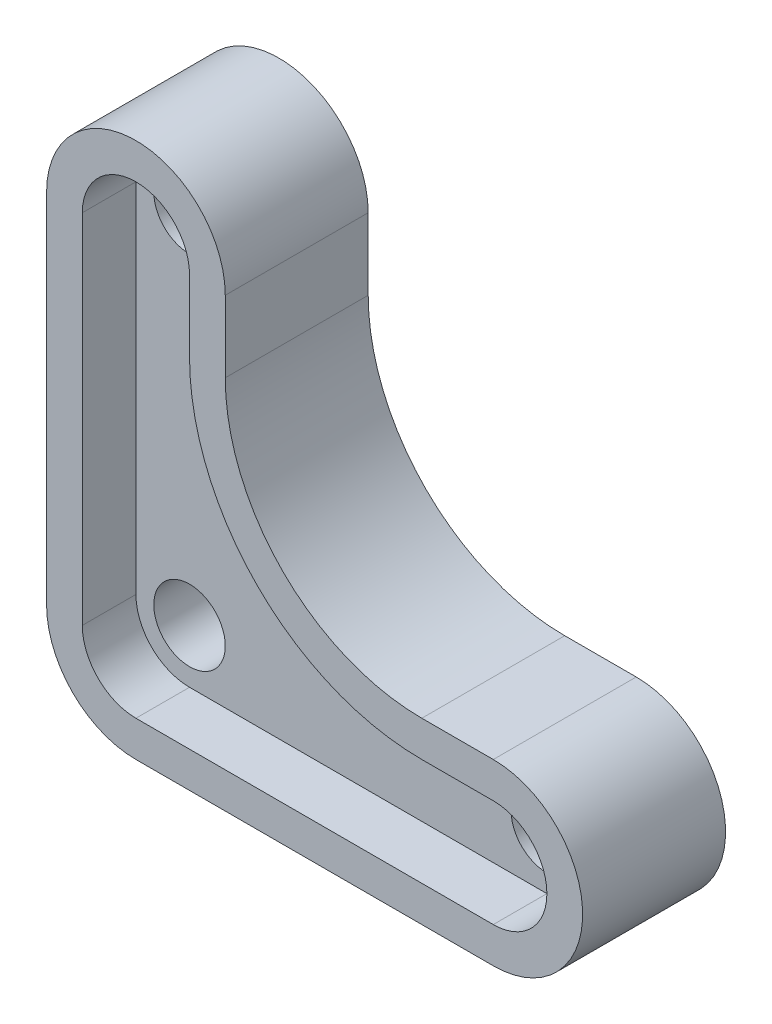
ISO-10303-21;
HEADER;
FILE_DESCRIPTION(('STEP AP214'),'2;1');
FILE_NAME('part.step','',(''),(''),'','','');
FILE_SCHEMA(('AUTOMOTIVE_DESIGN { 1 0 10303 214 1 1 1 1 }'));
ENDSEC;
DATA;
#1=APPLICATION_CONTEXT('core data for automotive mechanical design processes');
#2=APPLICATION_PROTOCOL_DEFINITION('international standard','automotive_design',2000,#1);
#3=PRODUCT_CONTEXT('',#1,'mechanical');
#4=PRODUCT('Part','Part','',(#3));
#5=PRODUCT_RELATED_PRODUCT_CATEGORY('part','',(#4));
#6=PRODUCT_DEFINITION_FORMATION('','',#4);
#7=PRODUCT_DEFINITION_CONTEXT('part definition',#1,'design');
#8=PRODUCT_DEFINITION('design','',#6,#7);
#9=PRODUCT_DEFINITION_SHAPE('','',#8);
#10=(LENGTH_UNIT() NAMED_UNIT(*) SI_UNIT(.MILLI.,.METRE.));
#11=(NAMED_UNIT(*) PLANE_ANGLE_UNIT() SI_UNIT($,.RADIAN.));
#12=(NAMED_UNIT(*) SI_UNIT($,.STERADIAN.) SOLID_ANGLE_UNIT());
#13=UNCERTAINTY_MEASURE_WITH_UNIT(LENGTH_MEASURE(1.E-05),#10,'distance_accuracy_value','');
#14=(GEOMETRIC_REPRESENTATION_CONTEXT(3) GLOBAL_UNCERTAINTY_ASSIGNED_CONTEXT((#13)) GLOBAL_UNIT_ASSIGNED_CONTEXT((#10,
#11,#12)) REPRESENTATION_CONTEXT('',''));
#15=CARTESIAN_POINT('',(0.,0.,0.));
#16=DIRECTION('',(0.,0.,1.));
#17=DIRECTION('',(1.,0.,0.));
#18=AXIS2_PLACEMENT_3D('',#15,#16,#17);
#19=CARTESIAN_POINT('',(0.,5.,5.));
#20=DIRECTION('',(0.,1.,0.));
#21=DIRECTION('',(-1.,0.,0.));
#22=AXIS2_PLACEMENT_3D('',#19,#20,#21);
#23=PLANE('',#22);
#24=DIRECTION('',(-1.,0.,0.));
#25=VECTOR('',#24,1.);
#26=CARTESIAN_POINT('',(0.,5.,5.));
#27=LINE('',#26,#25);
#28=CARTESIAN_POINT('',(0.,5.,5.));
#29=VERTEX_POINT('',#28);
#30=CARTESIAN_POINT('',(-4.,5.,5.));
#31=VERTEX_POINT('',#30);
#32=EDGE_CURVE('E210',#29,#31,#27,.T.);
#33=ORIENTED_EDGE('',*,*,#32,.T.);
#34=DIRECTION('',(0.,0.,1.));
#35=VECTOR('',#34,1.);
#36=CARTESIAN_POINT('',(-4.,5.,13.));
#37=LINE('',#36,#35);
#38=CARTESIAN_POINT('',(-4.,5.,13.));
#39=VERTEX_POINT('',#38);
#40=EDGE_CURVE('E278',#31,#39,#37,.T.);
#41=ORIENTED_EDGE('',*,*,#40,.T.);
#42=DIRECTION('',(-1.,0.,0.));
#43=VECTOR('',#42,1.);
#44=CARTESIAN_POINT('',(0.,5.,13.));
#45=LINE('',#44,#43);
#46=CARTESIAN_POINT('',(0.,5.,13.));
#47=VERTEX_POINT('',#46);
#48=EDGE_CURVE('E205',#47,#39,#45,.T.);
#49=ORIENTED_EDGE('',*,*,#48,.F.);
#50=DIRECTION('',(0.,0.,1.));
#51=VECTOR('',#50,1.);
#52=CARTESIAN_POINT('',(0.,5.,5.));
#53=LINE('',#52,#51);
#54=EDGE_CURVE('E242',#29,#47,#53,.T.);
#55=ORIENTED_EDGE('',*,*,#54,.F.);
#56=EDGE_LOOP('',(#33,#41,#49,#55));
#57=FACE_BOUND('',#56,.T.);
#58=ADVANCED_FACE('F39',(#57),#23,.T.);
#59=CARTESIAN_POINT('',(0.,0.,5.));
#60=DIRECTION('',(0.,0.,1.));
#61=DIRECTION('',(1.,0.,0.));
#62=AXIS2_PLACEMENT_3D('',#59,#60,#61);
#63=CYLINDRICAL_SURFACE('',#62,5.);
#64=CARTESIAN_POINT('',(0.,0.,13.));
#65=DIRECTION('',(0.,0.,1.));
#66=DIRECTION('',(1.,0.,0.));
#67=AXIS2_PLACEMENT_3D('',#64,#65,#66);
#68=CIRCLE('',#67,5.);
#69=CARTESIAN_POINT('',(0.,-5.,13.));
#70=VERTEX_POINT('',#69);
#71=EDGE_CURVE('E214',#70,#47,#68,.T.);
#72=ORIENTED_EDGE('',*,*,#71,.F.);
#73=DIRECTION('',(0.,0.,1.));
#74=VECTOR('',#73,1.);
#75=CARTESIAN_POINT('',(0.,-5.,5.));
#76=LINE('',#75,#74);
#77=CARTESIAN_POINT('',(0.,-5.,5.));
#78=VERTEX_POINT('',#77);
#79=EDGE_CURVE('E245',#78,#70,#76,.T.);
#80=ORIENTED_EDGE('',*,*,#79,.F.);
#81=CARTESIAN_POINT('',(0.,0.,5.));
#82=DIRECTION('',(0.,0.,1.));
#83=DIRECTION('',(1.,0.,0.));
#84=AXIS2_PLACEMENT_3D('',#81,#82,#83);
#85=CIRCLE('',#84,5.);
#86=EDGE_CURVE('E224',#78,#29,#85,.T.);
#87=ORIENTED_EDGE('',*,*,#86,.T.);
#88=ORIENTED_EDGE('',*,*,#54,.T.);
#89=EDGE_LOOP('',(#72,#80,#87,#88));
#90=FACE_BOUND('',#89,.T.);
#91=ADVANCED_FACE('F318',(#90),#63,.T.);
#92=CARTESIAN_POINT('',(-25.,-5.,5.));
#93=DIRECTION('',(0.,-1.,0.));
#94=DIRECTION('',(1.,0.,0.));
#95=AXIS2_PLACEMENT_3D('',#92,#93,#94);
#96=PLANE('',#95);
#97=DIRECTION('',(1.,0.,0.));
#98=VECTOR('',#97,1.);
#99=CARTESIAN_POINT('',(-25.,-5.,13.));
#100=LINE('',#99,#98);
#101=CARTESIAN_POINT('',(-20.,-5.,13.));
#102=VERTEX_POINT('',#101);
#103=EDGE_CURVE('E238',#102,#70,#100,.T.);
#104=ORIENTED_EDGE('',*,*,#103,.F.);
#105=DIRECTION('',(0.,0.,1.));
#106=VECTOR('',#105,1.);
#107=CARTESIAN_POINT('',(-20.,-5.,5.));
#108=LINE('',#107,#106);
#109=CARTESIAN_POINT('',(-20.,-5.,5.));
#110=VERTEX_POINT('',#109);
#111=EDGE_CURVE('E274',#102,#110,#108,.F.);
#112=ORIENTED_EDGE('',*,*,#111,.T.);
#113=DIRECTION('',(1.,0.,0.));
#114=VECTOR('',#113,1.);
#115=CARTESIAN_POINT('',(-25.,-5.,5.));
#116=LINE('',#115,#114);
#117=EDGE_CURVE('E222',#110,#78,#116,.T.);
#118=ORIENTED_EDGE('',*,*,#117,.T.);
#119=ORIENTED_EDGE('',*,*,#79,.T.);
#120=EDGE_LOOP('',(#104,#112,#118,#119));
#121=FACE_BOUND('',#120,.T.);
#122=ADVANCED_FACE('F326',(#121),#96,.T.);
#123=CARTESIAN_POINT('',(-25.,20.,5.));
#124=DIRECTION('',(-1.,0.,0.));
#125=DIRECTION('',(0.,0.,1.));
#126=AXIS2_PLACEMENT_3D('',#123,#124,#125);
#127=PLANE('',#126);
#128=DIRECTION('',(0.,-1.,0.));
#129=VECTOR('',#128,1.);
#130=CARTESIAN_POINT('',(-25.,20.,5.));
#131=LINE('',#130,#129);
#132=CARTESIAN_POINT('',(-25.,20.,5.));
#133=VERTEX_POINT('',#132);
#134=CARTESIAN_POINT('',(-25.,0.,5.));
#135=VERTEX_POINT('',#134);
#136=EDGE_CURVE('E219',#133,#135,#131,.T.);
#137=ORIENTED_EDGE('',*,*,#136,.T.);
#138=DIRECTION('',(0.,0.,1.));
#139=VECTOR('',#138,1.);
#140=CARTESIAN_POINT('',(-25.,0.,5.));
#141=LINE('',#140,#139);
#142=CARTESIAN_POINT('',(-25.,0.,13.));
#143=VERTEX_POINT('',#142);
#144=EDGE_CURVE('E269',#135,#143,#141,.T.);
#145=ORIENTED_EDGE('',*,*,#144,.T.);
#146=DIRECTION('',(0.,-1.,0.));
#147=VECTOR('',#146,1.);
#148=CARTESIAN_POINT('',(-25.,20.,13.));
#149=LINE('',#148,#147);
#150=CARTESIAN_POINT('',(-25.,20.,13.));
#151=VERTEX_POINT('',#150);
#152=EDGE_CURVE('E235',#151,#143,#149,.T.);
#153=ORIENTED_EDGE('',*,*,#152,.F.);
#154=DIRECTION('',(0.,0.,1.));
#155=VECTOR('',#154,1.);
#156=CARTESIAN_POINT('',(-25.,20.,5.));
#157=LINE('',#156,#155);
#158=EDGE_CURVE('E248',#133,#151,#157,.T.);
#159=ORIENTED_EDGE('',*,*,#158,.F.);
#160=EDGE_LOOP('',(#137,#145,#153,#159));
#161=FACE_BOUND('',#160,.T.);
#162=ADVANCED_FACE('F350',(#161),#127,.T.);
#163=CARTESIAN_POINT('',(-20.,20.,5.));
#164=DIRECTION('',(0.,0.,1.));
#165=DIRECTION('',(1.,0.,0.));
#166=AXIS2_PLACEMENT_3D('',#163,#164,#165);
#167=CYLINDRICAL_SURFACE('',#166,5.);
#168=CARTESIAN_POINT('',(-20.,20.,13.));
#169=DIRECTION('',(0.,0.,1.));
#170=DIRECTION('',(1.,0.,0.));
#171=AXIS2_PLACEMENT_3D('',#168,#169,#170);
#172=CIRCLE('',#171,5.);
#173=CARTESIAN_POINT('',(-15.,20.,13.));
#174=VERTEX_POINT('',#173);
#175=EDGE_CURVE('E232',#174,#151,#172,.T.);
#176=ORIENTED_EDGE('',*,*,#175,.F.);
#177=DIRECTION('',(0.,0.,1.));
#178=VECTOR('',#177,1.);
#179=CARTESIAN_POINT('',(-15.,20.,5.));
#180=LINE('',#179,#178);
#181=CARTESIAN_POINT('',(-15.,20.,5.));
#182=VERTEX_POINT('',#181);
#183=EDGE_CURVE('E227',#182,#174,#180,.T.);
#184=ORIENTED_EDGE('',*,*,#183,.F.);
#185=CARTESIAN_POINT('',(-20.,20.,5.));
#186=DIRECTION('',(0.,0.,1.));
#187=DIRECTION('',(1.,0.,0.));
#188=AXIS2_PLACEMENT_3D('',#185,#186,#187);
#189=CIRCLE('',#188,5.);
#190=EDGE_CURVE('E216',#182,#133,#189,.T.);
#191=ORIENTED_EDGE('',*,*,#190,.T.);
#192=ORIENTED_EDGE('',*,*,#158,.T.);
#193=EDGE_LOOP('',(#176,#184,#191,#192));
#194=FACE_BOUND('',#193,.T.);
#195=ADVANCED_FACE('F354',(#194),#167,.T.);
#196=CARTESIAN_POINT('',(-15.,5.,5.));
#197=DIRECTION('',(1.,0.,0.));
#198=DIRECTION('',(0.,0.,-1.));
#199=AXIS2_PLACEMENT_3D('',#196,#197,#198);
#200=PLANE('',#199);
#201=DIRECTION('',(0.,1.,0.));
#202=VECTOR('',#201,1.);
#203=CARTESIAN_POINT('',(-15.,5.,13.));
#204=LINE('',#203,#202);
#205=CARTESIAN_POINT('',(-15.,16.,13.));
#206=VERTEX_POINT('',#205);
#207=EDGE_CURVE('E230',#206,#174,#204,.T.);
#208=ORIENTED_EDGE('',*,*,#207,.F.);
#209=DIRECTION('',(0.,0.,1.));
#210=VECTOR('',#209,1.);
#211=CARTESIAN_POINT('',(-15.,16.,5.));
#212=LINE('',#211,#210);
#213=CARTESIAN_POINT('',(-15.,16.,5.));
#214=VERTEX_POINT('',#213);
#215=EDGE_CURVE('E281',#206,#214,#212,.F.);
#216=ORIENTED_EDGE('',*,*,#215,.T.);
#217=DIRECTION('',(0.,1.,0.));
#218=VECTOR('',#217,1.);
#219=CARTESIAN_POINT('',(-15.,5.,5.));
#220=LINE('',#219,#218);
#221=EDGE_CURVE('E213',#214,#182,#220,.T.);
#222=ORIENTED_EDGE('',*,*,#221,.T.);
#223=ORIENTED_EDGE('',*,*,#183,.T.);
#224=EDGE_LOOP('',(#208,#216,#222,#223));
#225=FACE_BOUND('',#224,.T.);
#226=ADVANCED_FACE('F331',(#225),#200,.T.);
#227=CARTESIAN_POINT('',(-20.,20.,5.));
#228=DIRECTION('',(0.,0.,1.));
#229=DIRECTION('',(1.,0.,0.));
#230=AXIS2_PLACEMENT_3D('',#227,#228,#229);
#231=PLANE('',#230);
#232=CARTESIAN_POINT('',(-20.,20.,5.));
#233=DIRECTION('',(0.,0.,-1.));
#234=DIRECTION('',(-1.,0.,0.));
#235=AXIS2_PLACEMENT_3D('',#232,#233,#234);
#236=CIRCLE('',#235,1.99999999999998);
#237=CARTESIAN_POINT('',(-22.,20.,5.));
#238=VERTEX_POINT('',#237);
#239=EDGE_CURVE('E261',#238,#238,#236,.T.);
#240=ORIENTED_EDGE('',*,*,#239,.F.);
#241=EDGE_LOOP('',(#240));
#242=FACE_BOUND('',#241,.T.);
#243=CARTESIAN_POINT('',(-20.,0.,5.));
#244=DIRECTION('',(0.,0.,-1.));
#245=DIRECTION('',(-1.,0.,0.));
#246=AXIS2_PLACEMENT_3D('',#243,#244,#245);
#247=CIRCLE('',#246,1.99999999999998);
#248=CARTESIAN_POINT('',(-22.,0.,5.));
#249=VERTEX_POINT('',#248);
#250=EDGE_CURVE('E257',#249,#249,#247,.T.);
#251=ORIENTED_EDGE('',*,*,#250,.F.);
#252=EDGE_LOOP('',(#251));
#253=FACE_BOUND('',#252,.T.);
#254=CARTESIAN_POINT('',(0.,0.,5.));
#255=DIRECTION('',(0.,0.,-1.));
#256=DIRECTION('',(-1.,0.,0.));
#257=AXIS2_PLACEMENT_3D('',#254,#255,#256);
#258=CIRCLE('',#257,1.99999999999999);
#259=CARTESIAN_POINT('',(-1.99999999999999,0.,5.));
#260=VERTEX_POINT('',#259);
#261=EDGE_CURVE('E183',#260,#260,#258,.T.);
#262=ORIENTED_EDGE('',*,*,#261,.F.);
#263=EDGE_LOOP('',(#262));
#264=FACE_BOUND('',#263,.T.);
#265=ORIENTED_EDGE('',*,*,#117,.F.);
#266=CARTESIAN_POINT('',(-20.,0.,5.));
#267=DIRECTION('',(0.,0.,1.));
#268=DIRECTION('',(1.,0.,0.));
#269=AXIS2_PLACEMENT_3D('',#266,#267,#268);
#270=CIRCLE('',#269,5.);
#271=EDGE_CURVE('E276',#110,#135,#270,.F.);
#272=ORIENTED_EDGE('',*,*,#271,.T.);
#273=ORIENTED_EDGE('',*,*,#136,.F.);
#274=ORIENTED_EDGE('',*,*,#190,.F.);
#275=ORIENTED_EDGE('',*,*,#221,.F.);
#276=CARTESIAN_POINT('',(-4.,16.,5.));
#277=DIRECTION('',(0.,0.,1.));
#278=DIRECTION('',(1.,0.,0.));
#279=AXIS2_PLACEMENT_3D('',#276,#277,#278);
#280=CIRCLE('',#279,11.);
#281=EDGE_CURVE('E285',#214,#31,#280,.T.);
#282=ORIENTED_EDGE('',*,*,#281,.T.);
#283=ORIENTED_EDGE('',*,*,#32,.F.);
#284=ORIENTED_EDGE('',*,*,#86,.F.);
#285=EDGE_LOOP('',(#265,#272,#273,#274,#275,#282,#283,#284));
#286=FACE_BOUND('',#285,.T.);
#287=ADVANCED_FACE('F346',(#242,#253,#264,#286),#231,.F.);
#288=CARTESIAN_POINT('',(-20.,20.,13.));
#289=DIRECTION('',(0.,0.,1.));
#290=DIRECTION('',(1.,0.,0.));
#291=AXIS2_PLACEMENT_3D('',#288,#289,#290);
#292=PLANE('',#291);
#293=DIRECTION('',(0.,1.,0.));
#294=VECTOR('',#293,1.);
#295=CARTESIAN_POINT('',(-17.,3.,13.));
#296=LINE('',#295,#294);
#297=CARTESIAN_POINT('',(-17.,16.,13.));
#298=VERTEX_POINT('',#297);
#299=CARTESIAN_POINT('',(-17.,20.,13.));
#300=VERTEX_POINT('',#299);
#301=EDGE_CURVE('E178',#298,#300,#296,.T.);
#302=ORIENTED_EDGE('',*,*,#301,.F.);
#303=CARTESIAN_POINT('',(-4.,16.,13.));
#304=DIRECTION('',(0.,0.,1.));
#305=DIRECTION('',(1.,0.,0.));
#306=AXIS2_PLACEMENT_3D('',#303,#304,#305);
#307=CIRCLE('',#306,13.);
#308=CARTESIAN_POINT('',(-4.,3.,13.));
#309=VERTEX_POINT('',#308);
#310=EDGE_CURVE('E61',#298,#309,#307,.T.);
#311=ORIENTED_EDGE('',*,*,#310,.T.);
#312=DIRECTION('',(-1.,0.,0.));
#313=VECTOR('',#312,1.);
#314=CARTESIAN_POINT('',(0.,3.,13.));
#315=LINE('',#314,#313);
#316=CARTESIAN_POINT('',(0.,3.,13.));
#317=VERTEX_POINT('',#316);
#318=EDGE_CURVE('E180',#317,#309,#315,.T.);
#319=ORIENTED_EDGE('',*,*,#318,.F.);
#320=CARTESIAN_POINT('',(0.,0.,13.));
#321=DIRECTION('',(0.,0.,1.));
#322=DIRECTION('',(1.,0.,0.));
#323=AXIS2_PLACEMENT_3D('',#320,#321,#322);
#324=CIRCLE('',#323,3.);
#325=CARTESIAN_POINT('',(0.,-3.,13.));
#326=VERTEX_POINT('',#325);
#327=EDGE_CURVE('E199',#326,#317,#324,.T.);
#328=ORIENTED_EDGE('',*,*,#327,.F.);
#329=DIRECTION('',(1.,0.,0.));
#330=VECTOR('',#329,1.);
#331=CARTESIAN_POINT('',(-23.,-3.,13.));
#332=LINE('',#331,#330);
#333=CARTESIAN_POINT('',(-20.,-3.,13.));
#334=VERTEX_POINT('',#333);
#335=EDGE_CURVE('E197',#334,#326,#332,.T.);
#336=ORIENTED_EDGE('',*,*,#335,.F.);
#337=CARTESIAN_POINT('',(-20.,0.,13.));
#338=DIRECTION('',(0.,0.,1.));
#339=DIRECTION('',(1.,0.,0.));
#340=AXIS2_PLACEMENT_3D('',#337,#338,#339);
#341=CIRCLE('',#340,3.);
#342=CARTESIAN_POINT('',(-23.,0.,13.));
#343=VERTEX_POINT('',#342);
#344=EDGE_CURVE('E267',#334,#343,#341,.F.);
#345=ORIENTED_EDGE('',*,*,#344,.T.);
#346=DIRECTION('',(0.,-1.,0.));
#347=VECTOR('',#346,1.);
#348=CARTESIAN_POINT('',(-23.,20.,13.));
#349=LINE('',#348,#347);
#350=CARTESIAN_POINT('',(-23.,20.,13.));
#351=VERTEX_POINT('',#350);
#352=EDGE_CURVE('E194',#351,#343,#349,.T.);
#353=ORIENTED_EDGE('',*,*,#352,.F.);
#354=CARTESIAN_POINT('',(-20.,20.,13.));
#355=DIRECTION('',(0.,0.,1.));
#356=DIRECTION('',(1.,0.,0.));
#357=AXIS2_PLACEMENT_3D('',#354,#355,#356);
#358=CIRCLE('',#357,3.);
#359=EDGE_CURVE('E159',#300,#351,#358,.T.);
#360=ORIENTED_EDGE('',*,*,#359,.F.);
#361=EDGE_LOOP('',(#302,#311,#319,#328,#336,#345,#353,#360));
#362=FACE_BOUND('',#361,.T.);
#363=ORIENTED_EDGE('',*,*,#152,.T.);
#364=CARTESIAN_POINT('',(-20.,0.,13.));
#365=DIRECTION('',(0.,0.,1.));
#366=DIRECTION('',(1.,0.,0.));
#367=AXIS2_PLACEMENT_3D('',#364,#365,#366);
#368=CIRCLE('',#367,5.);
#369=EDGE_CURVE('E272',#143,#102,#368,.T.);
#370=ORIENTED_EDGE('',*,*,#369,.T.);
#371=ORIENTED_EDGE('',*,*,#103,.T.);
#372=ORIENTED_EDGE('',*,*,#71,.T.);
#373=ORIENTED_EDGE('',*,*,#48,.T.);
#374=CARTESIAN_POINT('',(-4.,16.,13.));
#375=DIRECTION('',(0.,0.,1.));
#376=DIRECTION('',(1.,0.,0.));
#377=AXIS2_PLACEMENT_3D('',#374,#375,#376);
#378=CIRCLE('',#377,11.);
#379=EDGE_CURVE('E283',#39,#206,#378,.F.);
#380=ORIENTED_EDGE('',*,*,#379,.T.);
#381=ORIENTED_EDGE('',*,*,#207,.T.);
#382=ORIENTED_EDGE('',*,*,#175,.T.);
#383=EDGE_LOOP('',(#363,#370,#371,#372,#373,#380,#381,#382));
#384=FACE_BOUND('',#383,.T.);
#385=ADVANCED_FACE('F295',(#362,#384),#292,.T.);
#386=CARTESIAN_POINT('',(-20.,20.,10.));
#387=DIRECTION('',(0.,0.,1.));
#388=DIRECTION('',(1.,0.,0.));
#389=AXIS2_PLACEMENT_3D('',#386,#387,#388);
#390=CYLINDRICAL_SURFACE('',#389,3.);
#391=ORIENTED_EDGE('',*,*,#359,.T.);
#392=DIRECTION('',(0.,0.,1.));
#393=VECTOR('',#392,1.);
#394=CARTESIAN_POINT('',(-23.,20.,10.));
#395=LINE('',#394,#393);
#396=CARTESIAN_POINT('',(-23.,20.,10.));
#397=VERTEX_POINT('',#396);
#398=EDGE_CURVE('E152',#397,#351,#395,.T.);
#399=ORIENTED_EDGE('',*,*,#398,.F.);
#400=CARTESIAN_POINT('',(-20.,20.,10.));
#401=DIRECTION('',(0.,0.,1.));
#402=DIRECTION('',(1.,0.,0.));
#403=AXIS2_PLACEMENT_3D('',#400,#401,#402);
#404=CIRCLE('',#403,3.);
#405=CARTESIAN_POINT('',(-17.,20.,10.));
#406=VERTEX_POINT('',#405);
#407=EDGE_CURVE('E157',#406,#397,#404,.T.);
#408=ORIENTED_EDGE('',*,*,#407,.F.);
#409=DIRECTION('',(0.,0.,1.));
#410=VECTOR('',#409,1.);
#411=CARTESIAN_POINT('',(-17.,20.,10.));
#412=LINE('',#411,#410);
#413=EDGE_CURVE('E203',#406,#300,#412,.T.);
#414=ORIENTED_EDGE('',*,*,#413,.T.);
#415=EDGE_LOOP('',(#391,#399,#408,#414));
#416=FACE_BOUND('',#415,.T.);
#417=ADVANCED_FACE('F154',(#416),#390,.F.);
#418=CARTESIAN_POINT('',(-17.,3.,10.));
#419=DIRECTION('',(1.,0.,0.));
#420=DIRECTION('',(0.,0.,-1.));
#421=AXIS2_PLACEMENT_3D('',#418,#419,#420);
#422=PLANE('',#421);
#423=DIRECTION('',(0.,1.,0.));
#424=VECTOR('',#423,1.);
#425=CARTESIAN_POINT('',(-17.,3.,10.));
#426=LINE('',#425,#424);
#427=CARTESIAN_POINT('',(-17.,16.,10.));
#428=VERTEX_POINT('',#427);
#429=EDGE_CURVE('E164',#428,#406,#426,.T.);
#430=ORIENTED_EDGE('',*,*,#429,.F.);
#431=DIRECTION('',(0.,0.,1.));
#432=VECTOR('',#431,1.);
#433=CARTESIAN_POINT('',(-17.,16.,10.));
#434=LINE('',#433,#432);
#435=EDGE_CURVE('E287',#428,#298,#434,.T.);
#436=ORIENTED_EDGE('',*,*,#435,.T.);
#437=ORIENTED_EDGE('',*,*,#301,.T.);
#438=ORIENTED_EDGE('',*,*,#413,.F.);
#439=EDGE_LOOP('',(#430,#436,#437,#438));
#440=FACE_BOUND('',#439,.T.);
#441=ADVANCED_FACE('F292',(#440),#422,.F.);
#442=CARTESIAN_POINT('',(0.,3.,10.));
#443=DIRECTION('',(0.,1.,0.));
#444=DIRECTION('',(-1.,0.,0.));
#445=AXIS2_PLACEMENT_3D('',#442,#443,#444);
#446=PLANE('',#445);
#447=ORIENTED_EDGE('',*,*,#318,.T.);
#448=DIRECTION('',(0.,0.,1.));
#449=VECTOR('',#448,1.);
#450=CARTESIAN_POINT('',(-4.,3.,10.));
#451=LINE('',#450,#449);
#452=CARTESIAN_POINT('',(-4.,3.,10.));
#453=VERTEX_POINT('',#452);
#454=EDGE_CURVE('E47',#309,#453,#451,.F.);
#455=ORIENTED_EDGE('',*,*,#454,.T.);
#456=DIRECTION('',(-1.,0.,0.));
#457=VECTOR('',#456,1.);
#458=CARTESIAN_POINT('',(0.,3.,10.));
#459=LINE('',#458,#457);
#460=CARTESIAN_POINT('',(0.,3.,10.));
#461=VERTEX_POINT('',#460);
#462=EDGE_CURVE('E190',#461,#453,#459,.T.);
#463=ORIENTED_EDGE('',*,*,#462,.F.);
#464=DIRECTION('',(0.,0.,1.));
#465=VECTOR('',#464,1.);
#466=CARTESIAN_POINT('',(0.,3.,10.));
#467=LINE('',#466,#465);
#468=EDGE_CURVE('E206',#461,#317,#467,.T.);
#469=ORIENTED_EDGE('',*,*,#468,.T.);
#470=EDGE_LOOP('',(#447,#455,#463,#469));
#471=FACE_BOUND('',#470,.T.);
#472=ADVANCED_FACE('F396',(#471),#446,.F.);
#473=CARTESIAN_POINT('',(0.,0.,10.));
#474=DIRECTION('',(0.,0.,1.));
#475=DIRECTION('',(1.,0.,0.));
#476=AXIS2_PLACEMENT_3D('',#473,#474,#475);
#477=CYLINDRICAL_SURFACE('',#476,3.);
#478=ORIENTED_EDGE('',*,*,#327,.T.);
#479=ORIENTED_EDGE('',*,*,#468,.F.);
#480=CARTESIAN_POINT('',(0.,0.,10.));
#481=DIRECTION('',(0.,0.,1.));
#482=DIRECTION('',(1.,0.,0.));
#483=AXIS2_PLACEMENT_3D('',#480,#481,#482);
#484=CIRCLE('',#483,3.);
#485=CARTESIAN_POINT('',(0.,-3.,10.));
#486=VERTEX_POINT('',#485);
#487=EDGE_CURVE('E187',#486,#461,#484,.T.);
#488=ORIENTED_EDGE('',*,*,#487,.F.);
#489=DIRECTION('',(0.,0.,1.));
#490=VECTOR('',#489,1.);
#491=CARTESIAN_POINT('',(0.,-3.,10.));
#492=LINE('',#491,#490);
#493=EDGE_CURVE('E163',#486,#326,#492,.T.);
#494=ORIENTED_EDGE('',*,*,#493,.T.);
#495=EDGE_LOOP('',(#478,#479,#488,#494));
#496=FACE_BOUND('',#495,.T.);
#497=ADVANCED_FACE('F308',(#496),#477,.F.);
#498=CARTESIAN_POINT('',(-23.,-3.,10.));
#499=DIRECTION('',(0.,-1.,0.));
#500=DIRECTION('',(0.,0.,-1.));
#501=AXIS2_PLACEMENT_3D('',#498,#499,#500);
#502=PLANE('',#501);
#503=DIRECTION('',(1.,0.,0.));
#504=VECTOR('',#503,1.);
#505=CARTESIAN_POINT('',(-23.,-3.,10.));
#506=LINE('',#505,#504);
#507=CARTESIAN_POINT('',(-20.,-3.,10.));
#508=VERTEX_POINT('',#507);
#509=EDGE_CURVE('E173',#508,#486,#506,.T.);
#510=ORIENTED_EDGE('',*,*,#509,.F.);
#511=DIRECTION('',(0.,0.,1.));
#512=VECTOR('',#511,1.);
#513=CARTESIAN_POINT('',(-20.,-3.,13.));
#514=LINE('',#513,#512);
#515=EDGE_CURVE('E244',#508,#334,#514,.T.);
#516=ORIENTED_EDGE('',*,*,#515,.T.);
#517=ORIENTED_EDGE('',*,*,#335,.T.);
#518=ORIENTED_EDGE('',*,*,#493,.F.);
#519=EDGE_LOOP('',(#510,#516,#517,#518));
#520=FACE_BOUND('',#519,.T.);
#521=ADVANCED_FACE('F304',(#520),#502,.F.);
#522=CARTESIAN_POINT('',(-23.,20.,10.));
#523=DIRECTION('',(-1.,0.,0.));
#524=DIRECTION('',(0.,0.,1.));
#525=AXIS2_PLACEMENT_3D('',#522,#523,#524);
#526=PLANE('',#525);
#527=ORIENTED_EDGE('',*,*,#352,.T.);
#528=DIRECTION('',(0.,0.,1.));
#529=VECTOR('',#528,1.);
#530=CARTESIAN_POINT('',(-23.,0.,10.));
#531=LINE('',#530,#529);
#532=CARTESIAN_POINT('',(-23.,0.,10.));
#533=VERTEX_POINT('',#532);
#534=EDGE_CURVE('E170',#343,#533,#531,.F.);
#535=ORIENTED_EDGE('',*,*,#534,.T.);
#536=DIRECTION('',(0.,-1.,0.));
#537=VECTOR('',#536,1.);
#538=CARTESIAN_POINT('',(-23.,20.,10.));
#539=LINE('',#538,#537);
#540=EDGE_CURVE('E167',#397,#533,#539,.T.);
#541=ORIENTED_EDGE('',*,*,#540,.F.);
#542=ORIENTED_EDGE('',*,*,#398,.T.);
#543=EDGE_LOOP('',(#527,#535,#541,#542));
#544=FACE_BOUND('',#543,.T.);
#545=ADVANCED_FACE('F168',(#544),#526,.F.);
#546=CARTESIAN_POINT('',(-20.,20.,10.));
#547=DIRECTION('',(0.,0.,1.));
#548=DIRECTION('',(1.,0.,0.));
#549=AXIS2_PLACEMENT_3D('',#546,#547,#548);
#550=PLANE('',#549);
#551=CARTESIAN_POINT('',(-20.,20.,10.));
#552=DIRECTION('',(0.,0.,1.));
#553=DIRECTION('',(1.,0.,0.));
#554=AXIS2_PLACEMENT_3D('',#551,#552,#553);
#555=CIRCLE('',#554,1.99999999999998);
#556=CARTESIAN_POINT('',(-18.,20.,10.));
#557=VERTEX_POINT('',#556);
#558=EDGE_CURVE('E258',#557,#557,#555,.T.);
#559=ORIENTED_EDGE('',*,*,#558,.F.);
#560=EDGE_LOOP('',(#559));
#561=FACE_BOUND('',#560,.T.);
#562=CARTESIAN_POINT('',(-20.,0.,10.));
#563=DIRECTION('',(0.,0.,1.));
#564=DIRECTION('',(1.,0.,0.));
#565=AXIS2_PLACEMENT_3D('',#562,#563,#564);
#566=CIRCLE('',#565,1.99999999999998);
#567=CARTESIAN_POINT('',(-18.,0.,10.));
#568=VERTEX_POINT('',#567);
#569=EDGE_CURVE('E254',#568,#568,#566,.T.);
#570=ORIENTED_EDGE('',*,*,#569,.F.);
#571=EDGE_LOOP('',(#570));
#572=FACE_BOUND('',#571,.T.);
#573=CARTESIAN_POINT('',(0.,0.,10.));
#574=DIRECTION('',(0.,0.,1.));
#575=DIRECTION('',(1.,0.,0.));
#576=AXIS2_PLACEMENT_3D('',#573,#574,#575);
#577=CIRCLE('',#576,1.99999999999999);
#578=CARTESIAN_POINT('',(1.99999999999999,0.,10.));
#579=VERTEX_POINT('',#578);
#580=EDGE_CURVE('E195',#579,#579,#577,.T.);
#581=ORIENTED_EDGE('',*,*,#580,.F.);
#582=EDGE_LOOP('',(#581));
#583=FACE_BOUND('',#582,.T.);
#584=ORIENTED_EDGE('',*,*,#540,.T.);
#585=CARTESIAN_POINT('',(-20.,0.,10.));
#586=DIRECTION('',(0.,0.,1.));
#587=DIRECTION('',(1.,0.,0.));
#588=AXIS2_PLACEMENT_3D('',#585,#586,#587);
#589=CIRCLE('',#588,3.);
#590=EDGE_CURVE('E265',#533,#508,#589,.T.);
#591=ORIENTED_EDGE('',*,*,#590,.T.);
#592=ORIENTED_EDGE('',*,*,#509,.T.);
#593=ORIENTED_EDGE('',*,*,#487,.T.);
#594=ORIENTED_EDGE('',*,*,#462,.T.);
#595=CARTESIAN_POINT('',(-4.,16.,10.));
#596=DIRECTION('',(0.,0.,1.));
#597=DIRECTION('',(1.,0.,0.));
#598=AXIS2_PLACEMENT_3D('',#595,#596,#597);
#599=CIRCLE('',#598,13.);
#600=EDGE_CURVE('E11',#453,#428,#599,.F.);
#601=ORIENTED_EDGE('',*,*,#600,.T.);
#602=ORIENTED_EDGE('',*,*,#429,.T.);
#603=ORIENTED_EDGE('',*,*,#407,.T.);
#604=EDGE_LOOP('',(#584,#591,#592,#593,#594,#601,#602,#603));
#605=FACE_BOUND('',#604,.T.);
#606=ADVANCED_FACE('F175',(#561,#572,#583,#605),#550,.T.);
#607=CARTESIAN_POINT('',(0.,0.,5.));
#608=DIRECTION('',(0.,0.,-1.));
#609=DIRECTION('',(-1.,0.,0.));
#610=AXIS2_PLACEMENT_3D('',#607,#608,#609);
#611=CYLINDRICAL_SURFACE('',#610,1.99999999999999);
#612=ORIENTED_EDGE('',*,*,#580,.T.);
#613=EDGE_LOOP('',(#612));
#614=FACE_BOUND('',#613,.T.);
#615=ORIENTED_EDGE('',*,*,#261,.T.);
#616=EDGE_LOOP('',(#615));
#617=FACE_BOUND('',#616,.T.);
#618=ADVANCED_FACE('F402',(#614,#617),#611,.F.);
#619=CARTESIAN_POINT('',(-20.,0.,5.));
#620=DIRECTION('',(0.,0.,-1.));
#621=DIRECTION('',(-1.,0.,0.));
#622=AXIS2_PLACEMENT_3D('',#619,#620,#621);
#623=CYLINDRICAL_SURFACE('',#622,1.99999999999998);
#624=ORIENTED_EDGE('',*,*,#569,.T.);
#625=EDGE_LOOP('',(#624));
#626=FACE_BOUND('',#625,.T.);
#627=ORIENTED_EDGE('',*,*,#250,.T.);
#628=EDGE_LOOP('',(#627));
#629=FACE_BOUND('',#628,.T.);
#630=ADVANCED_FACE('F406',(#626,#629),#623,.F.);
#631=CARTESIAN_POINT('',(-20.,20.,5.));
#632=DIRECTION('',(0.,0.,-1.));
#633=DIRECTION('',(-1.,0.,0.));
#634=AXIS2_PLACEMENT_3D('',#631,#632,#633);
#635=CYLINDRICAL_SURFACE('',#634,1.99999999999998);
#636=ORIENTED_EDGE('',*,*,#558,.T.);
#637=EDGE_LOOP('',(#636));
#638=FACE_BOUND('',#637,.T.);
#639=ORIENTED_EDGE('',*,*,#239,.T.);
#640=EDGE_LOOP('',(#639));
#641=FACE_BOUND('',#640,.T.);
#642=ADVANCED_FACE('F335',(#638,#641),#635,.F.);
#643=CARTESIAN_POINT('',(-20.,0.,10.));
#644=DIRECTION('',(0.,0.,-1.));
#645=DIRECTION('',(-1.,0.,0.));
#646=AXIS2_PLACEMENT_3D('',#643,#644,#645);
#647=CYLINDRICAL_SURFACE('',#646,3.);
#648=ORIENTED_EDGE('',*,*,#590,.F.);
#649=ORIENTED_EDGE('',*,*,#534,.F.);
#650=ORIENTED_EDGE('',*,*,#344,.F.);
#651=ORIENTED_EDGE('',*,*,#515,.F.);
#652=EDGE_LOOP('',(#648,#649,#650,#651));
#653=FACE_BOUND('',#652,.T.);
#654=ADVANCED_FACE('F299',(#653),#647,.F.);
#655=CARTESIAN_POINT('',(-20.,0.,5.));
#656=DIRECTION('',(0.,0.,1.));
#657=DIRECTION('',(1.,0.,0.));
#658=AXIS2_PLACEMENT_3D('',#655,#656,#657);
#659=CYLINDRICAL_SURFACE('',#658,5.);
#660=ORIENTED_EDGE('',*,*,#271,.F.);
#661=ORIENTED_EDGE('',*,*,#111,.F.);
#662=ORIENTED_EDGE('',*,*,#369,.F.);
#663=ORIENTED_EDGE('',*,*,#144,.F.);
#664=EDGE_LOOP('',(#660,#661,#662,#663));
#665=FACE_BOUND('',#664,.T.);
#666=ADVANCED_FACE('F315',(#665),#659,.T.);
#667=CARTESIAN_POINT('',(-4.,16.,5.));
#668=DIRECTION('',(0.,0.,-1.));
#669=DIRECTION('',(-1.,0.,0.));
#670=AXIS2_PLACEMENT_3D('',#667,#668,#669);
#671=CYLINDRICAL_SURFACE('',#670,11.);
#672=ORIENTED_EDGE('',*,*,#281,.F.);
#673=ORIENTED_EDGE('',*,*,#215,.F.);
#674=ORIENTED_EDGE('',*,*,#379,.F.);
#675=ORIENTED_EDGE('',*,*,#40,.F.);
#676=EDGE_LOOP('',(#672,#673,#674,#675));
#677=FACE_BOUND('',#676,.T.);
#678=ADVANCED_FACE('F310',(#677),#671,.F.);
#679=CARTESIAN_POINT('',(-4.,16.,10.));
#680=DIRECTION('',(0.,0.,1.));
#681=DIRECTION('',(1.,0.,0.));
#682=AXIS2_PLACEMENT_3D('',#679,#680,#681);
#683=CYLINDRICAL_SURFACE('',#682,13.);
#684=ORIENTED_EDGE('',*,*,#600,.F.);
#685=ORIENTED_EDGE('',*,*,#454,.F.);
#686=ORIENTED_EDGE('',*,*,#310,.F.);
#687=ORIENTED_EDGE('',*,*,#435,.F.);
#688=EDGE_LOOP('',(#684,#685,#686,#687));
#689=FACE_BOUND('',#688,.T.);
#690=ADVANCED_FACE('F41',(#689),#683,.T.);
#691=CLOSED_SHELL('',(#58,#91,#122,#162,#195,#226,#287,#385,#417,#441,#472,#497,#521,#545,#606,
#618,#630,#642,#654,#666,#678,#690));
#692=MANIFOLD_SOLID_BREP('B2',#691);
#693=ADVANCED_BREP_SHAPE_REPRESENTATION('',(#18,#692),#14);
#694=SHAPE_DEFINITION_REPRESENTATION(#9,#693);
ENDSEC;
END-ISO-10303-21;
